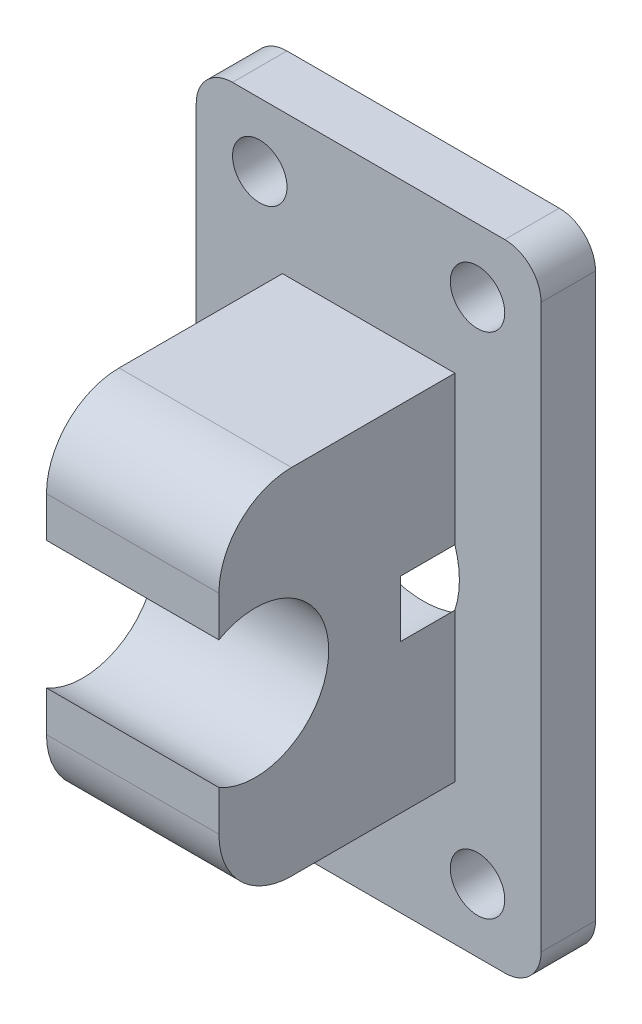
ISO-10303-21;
HEADER;
FILE_DESCRIPTION(('STEP AP214'),'2;1');
FILE_NAME('part.step','',(''),(''),'','','');
FILE_SCHEMA(('AUTOMOTIVE_DESIGN { 1 0 10303 214 1 1 1 1 }'));
ENDSEC;
DATA;
#1=APPLICATION_CONTEXT('core data for automotive mechanical design processes');
#2=APPLICATION_PROTOCOL_DEFINITION('international standard','automotive_design',2000,#1);
#3=PRODUCT_CONTEXT('',#1,'mechanical');
#4=PRODUCT('Part','Part','',(#3));
#5=PRODUCT_RELATED_PRODUCT_CATEGORY('part','',(#4));
#6=PRODUCT_DEFINITION_FORMATION('','',#4);
#7=PRODUCT_DEFINITION_CONTEXT('part definition',#1,'design');
#8=PRODUCT_DEFINITION('design','',#6,#7);
#9=PRODUCT_DEFINITION_SHAPE('','',#8);
#10=(LENGTH_UNIT() NAMED_UNIT(*) SI_UNIT(.MILLI.,.METRE.));
#11=(NAMED_UNIT(*) PLANE_ANGLE_UNIT() SI_UNIT($,.RADIAN.));
#12=(NAMED_UNIT(*) SI_UNIT($,.STERADIAN.) SOLID_ANGLE_UNIT());
#13=UNCERTAINTY_MEASURE_WITH_UNIT(LENGTH_MEASURE(1.E-05),#10,'distance_accuracy_value','');
#14=(GEOMETRIC_REPRESENTATION_CONTEXT(3) GLOBAL_UNCERTAINTY_ASSIGNED_CONTEXT((#13)) GLOBAL_UNIT_ASSIGNED_CONTEXT((#10,
#11,#12)) REPRESENTATION_CONTEXT('',''));
#15=CARTESIAN_POINT('',(0.,0.,0.));
#16=DIRECTION('',(0.,0.,1.));
#17=DIRECTION('',(1.,0.,0.));
#18=AXIS2_PLACEMENT_3D('',#15,#16,#17);
#19=CARTESIAN_POINT('',(0.,0.,3.));
#20=DIRECTION('',(0.,0.,1.));
#21=DIRECTION('',(1.,0.,0.));
#22=AXIS2_PLACEMENT_3D('',#19,#20,#21);
#23=PLANE('',#22);
#24=CARTESIAN_POINT('',(0.,0.,3.));
#25=DIRECTION('',(0.,0.,1.));
#26=DIRECTION('',(1.,0.,0.));
#27=AXIS2_PLACEMENT_3D('',#24,#25,#26);
#28=CIRCLE('',#27,5.);
#29=CARTESIAN_POINT('',(-4.75,1.56124949959959,3.));
#30=VERTEX_POINT('',#29);
#31=CARTESIAN_POINT('',(-4.75,-1.56124949959959,3.));
#32=VERTEX_POINT('',#31);
#33=EDGE_CURVE('E586',#30,#32,#28,.T.);
#34=ORIENTED_EDGE('',*,*,#33,.F.);
#35=DIRECTION('',(0.,-1.,0.));
#36=VECTOR('',#35,1.);
#37=CARTESIAN_POINT('',(-4.75,9.75,3.));
#38=LINE('',#37,#36);
#39=CARTESIAN_POINT('',(-4.75,9.75,3.));
#40=VERTEX_POINT('',#39);
#41=EDGE_CURVE('E197',#40,#30,#38,.T.);
#42=ORIENTED_EDGE('',*,*,#41,.F.);
#43=DIRECTION('',(-1.,0.,0.));
#44=VECTOR('',#43,1.);
#45=CARTESIAN_POINT('',(-4.75,9.75,3.));
#46=LINE('',#45,#44);
#47=CARTESIAN_POINT('',(4.75,9.75,3.));
#48=VERTEX_POINT('',#47);
#49=EDGE_CURVE('E577',#48,#40,#46,.T.);
#50=ORIENTED_EDGE('',*,*,#49,.F.);
#51=DIRECTION('',(0.,1.,0.));
#52=VECTOR('',#51,1.);
#53=CARTESIAN_POINT('',(4.75,9.75,3.));
#54=LINE('',#53,#52);
#55=CARTESIAN_POINT('',(4.75,1.56124949959961,3.));
#56=VERTEX_POINT('',#55);
#57=EDGE_CURVE('E573',#56,#48,#54,.T.);
#58=ORIENTED_EDGE('',*,*,#57,.F.);
#59=CARTESIAN_POINT('',(4.75,-1.5612494995996,3.));
#60=VERTEX_POINT('',#59);
#61=EDGE_CURVE('E583',#60,#56,#28,.T.);
#62=ORIENTED_EDGE('',*,*,#61,.F.);
#63=CARTESIAN_POINT('',(4.75,-9.75,3.));
#64=VERTEX_POINT('',#63);
#65=EDGE_CURVE('E574',#64,#60,#54,.T.);
#66=ORIENTED_EDGE('',*,*,#65,.F.);
#67=DIRECTION('',(1.,0.,0.));
#68=VECTOR('',#67,1.);
#69=CARTESIAN_POINT('',(-4.75,-9.75,3.));
#70=LINE('',#69,#68);
#71=CARTESIAN_POINT('',(-4.75,-9.75,3.));
#72=VERTEX_POINT('',#71);
#73=EDGE_CURVE('E232',#72,#64,#70,.T.);
#74=ORIENTED_EDGE('',*,*,#73,.F.);
#75=EDGE_CURVE('E226',#32,#72,#38,.T.);
#76=ORIENTED_EDGE('',*,*,#75,.F.);
#77=EDGE_LOOP('',(#34,#42,#50,#58,#62,#66,#74,#76));
#78=FACE_BOUND('',#77,.T.);
#79=CARTESIAN_POINT('',(6.,-14.,3.));
#80=DIRECTION('',(0.,0.,1.));
#81=DIRECTION('',(1.,0.,0.));
#82=AXIS2_PLACEMENT_3D('',#79,#80,#81);
#83=CIRCLE('',#82,1.5);
#84=CARTESIAN_POINT('',(7.5,-14.,3.));
#85=VERTEX_POINT('',#84);
#86=EDGE_CURVE('E244',#85,#85,#83,.T.);
#87=ORIENTED_EDGE('',*,*,#86,.F.);
#88=EDGE_LOOP('',(#87));
#89=FACE_BOUND('',#88,.T.);
#90=CARTESIAN_POINT('',(-6.,14.,3.));
#91=DIRECTION('',(0.,0.,1.));
#92=DIRECTION('',(1.,0.,0.));
#93=AXIS2_PLACEMENT_3D('',#90,#91,#92);
#94=CIRCLE('',#93,1.5);
#95=CARTESIAN_POINT('',(-4.5,14.,3.));
#96=VERTEX_POINT('',#95);
#97=EDGE_CURVE('E256',#96,#96,#94,.T.);
#98=ORIENTED_EDGE('',*,*,#97,.F.);
#99=EDGE_LOOP('',(#98));
#100=FACE_BOUND('',#99,.T.);
#101=DIRECTION('',(1.,0.,0.));
#102=VECTOR('',#101,1.);
#103=CARTESIAN_POINT('',(-9.5,-17.5,3.));
#104=LINE('',#103,#102);
#105=CARTESIAN_POINT('',(-7.5,-17.5,3.));
#106=VERTEX_POINT('',#105);
#107=CARTESIAN_POINT('',(7.5,-17.5,3.));
#108=VERTEX_POINT('',#107);
#109=EDGE_CURVE('E272',#106,#108,#104,.T.);
#110=ORIENTED_EDGE('',*,*,#109,.T.);
#111=CARTESIAN_POINT('',(7.5,-15.5,3.));
#112=DIRECTION('',(0.,0.,1.));
#113=DIRECTION('',(1.,0.,0.));
#114=AXIS2_PLACEMENT_3D('',#111,#112,#113);
#115=CIRCLE('',#114,2.);
#116=CARTESIAN_POINT('',(9.5,-15.5,3.));
#117=VERTEX_POINT('',#116);
#118=EDGE_CURVE('E315',#108,#117,#115,.T.);
#119=ORIENTED_EDGE('',*,*,#118,.T.);
#120=DIRECTION('',(0.,1.,0.));
#121=VECTOR('',#120,1.);
#122=CARTESIAN_POINT('',(9.5,17.5,3.));
#123=LINE('',#122,#121);
#124=CARTESIAN_POINT('',(9.5,15.5,3.));
#125=VERTEX_POINT('',#124);
#126=EDGE_CURVE('E262',#117,#125,#123,.T.);
#127=ORIENTED_EDGE('',*,*,#126,.T.);
#128=CARTESIAN_POINT('',(7.5,15.5,3.));
#129=DIRECTION('',(0.,0.,1.));
#130=DIRECTION('',(1.,0.,0.));
#131=AXIS2_PLACEMENT_3D('',#128,#129,#130);
#132=CIRCLE('',#131,2.);
#133=CARTESIAN_POINT('',(7.5,17.5,3.));
#134=VERTEX_POINT('',#133);
#135=EDGE_CURVE('E311',#125,#134,#132,.T.);
#136=ORIENTED_EDGE('',*,*,#135,.T.);
#137=DIRECTION('',(-1.,0.,0.));
#138=VECTOR('',#137,1.);
#139=CARTESIAN_POINT('',(-9.5,17.5,3.));
#140=LINE('',#139,#138);
#141=CARTESIAN_POINT('',(-7.5,17.5,3.));
#142=VERTEX_POINT('',#141);
#143=EDGE_CURVE('E265',#134,#142,#140,.T.);
#144=ORIENTED_EDGE('',*,*,#143,.T.);
#145=CARTESIAN_POINT('',(-7.5,15.5,3.));
#146=DIRECTION('',(0.,0.,1.));
#147=DIRECTION('',(1.,0.,0.));
#148=AXIS2_PLACEMENT_3D('',#145,#146,#147);
#149=CIRCLE('',#148,2.);
#150=CARTESIAN_POINT('',(-9.5,15.5,3.));
#151=VERTEX_POINT('',#150);
#152=EDGE_CURVE('E313',#142,#151,#149,.T.);
#153=ORIENTED_EDGE('',*,*,#152,.T.);
#154=DIRECTION('',(0.,-1.,0.));
#155=VECTOR('',#154,1.);
#156=CARTESIAN_POINT('',(-9.5,17.5,3.));
#157=LINE('',#156,#155);
#158=CARTESIAN_POINT('',(-9.5,-15.5,3.));
#159=VERTEX_POINT('',#158);
#160=EDGE_CURVE('E269',#151,#159,#157,.T.);
#161=ORIENTED_EDGE('',*,*,#160,.T.);
#162=CARTESIAN_POINT('',(-7.5,-15.5,3.));
#163=DIRECTION('',(0.,0.,1.));
#164=DIRECTION('',(1.,0.,0.));
#165=AXIS2_PLACEMENT_3D('',#162,#163,#164);
#166=CIRCLE('',#165,2.);
#167=EDGE_CURVE('E309',#159,#106,#166,.T.);
#168=ORIENTED_EDGE('',*,*,#167,.T.);
#169=EDGE_LOOP('',(#110,#119,#127,#136,#144,#153,#161,#168));
#170=FACE_BOUND('',#169,.T.);
#171=CARTESIAN_POINT('',(6.,14.,3.));
#172=DIRECTION('',(0.,0.,1.));
#173=DIRECTION('',(1.,0.,0.));
#174=AXIS2_PLACEMENT_3D('',#171,#172,#173);
#175=CIRCLE('',#174,1.5);
#176=CARTESIAN_POINT('',(7.5,14.,3.));
#177=VERTEX_POINT('',#176);
#178=EDGE_CURVE('E250',#177,#177,#175,.T.);
#179=ORIENTED_EDGE('',*,*,#178,.F.);
#180=EDGE_LOOP('',(#179));
#181=FACE_BOUND('',#180,.T.);
#182=CARTESIAN_POINT('',(-5.99999999999999,-14.,3.));
#183=DIRECTION('',(0.,0.,1.));
#184=DIRECTION('',(1.,0.,0.));
#185=AXIS2_PLACEMENT_3D('',#182,#183,#184);
#186=CIRCLE('',#185,1.5);
#187=CARTESIAN_POINT('',(-4.49999999999999,-14.,3.));
#188=VERTEX_POINT('',#187);
#189=EDGE_CURVE('E238',#188,#188,#186,.T.);
#190=ORIENTED_EDGE('',*,*,#189,.F.);
#191=EDGE_LOOP('',(#190));
#192=FACE_BOUND('',#191,.T.);
#193=ADVANCED_FACE('F36',(#78,#89,#100,#170,#181,#192),#23,.T.);
#194=CARTESIAN_POINT('',(0.,0.,0.));
#195=DIRECTION('',(0.,0.,1.));
#196=DIRECTION('',(1.,0.,0.));
#197=AXIS2_PLACEMENT_3D('',#194,#195,#196);
#198=PLANE('',#197);
#199=CARTESIAN_POINT('',(0.,0.,0.));
#200=DIRECTION('',(0.,0.,-1.));
#201=DIRECTION('',(-1.,0.,0.));
#202=AXIS2_PLACEMENT_3D('',#199,#200,#201);
#203=CIRCLE('',#202,5.);
#204=CARTESIAN_POINT('',(-5.,0.,0.));
#205=VERTEX_POINT('',#204);
#206=EDGE_CURVE('E593',#205,#205,#203,.T.);
#207=ORIENTED_EDGE('',*,*,#206,.F.);
#208=EDGE_LOOP('',(#207));
#209=FACE_BOUND('',#208,.T.);
#210=DIRECTION('',(0.,1.,0.));
#211=VECTOR('',#210,1.);
#212=CARTESIAN_POINT('',(9.5,17.5,0.));
#213=LINE('',#212,#211);
#214=CARTESIAN_POINT('',(9.5,-15.5,0.));
#215=VERTEX_POINT('',#214);
#216=CARTESIAN_POINT('',(9.5,15.5,0.));
#217=VERTEX_POINT('',#216);
#218=EDGE_CURVE('E259',#215,#217,#213,.T.);
#219=ORIENTED_EDGE('',*,*,#218,.F.);
#220=CARTESIAN_POINT('',(7.5,-15.5,0.));
#221=DIRECTION('',(0.,0.,1.));
#222=DIRECTION('',(1.,0.,0.));
#223=AXIS2_PLACEMENT_3D('',#220,#221,#222);
#224=CIRCLE('',#223,2.);
#225=CARTESIAN_POINT('',(7.5,-17.5,0.));
#226=VERTEX_POINT('',#225);
#227=EDGE_CURVE('E302',#215,#226,#224,.F.);
#228=ORIENTED_EDGE('',*,*,#227,.T.);
#229=DIRECTION('',(1.,0.,0.));
#230=VECTOR('',#229,1.);
#231=CARTESIAN_POINT('',(-9.5,-17.5,0.));
#232=LINE('',#231,#230);
#233=CARTESIAN_POINT('',(-7.5,-17.5,0.));
#234=VERTEX_POINT('',#233);
#235=EDGE_CURVE('E266',#234,#226,#232,.T.);
#236=ORIENTED_EDGE('',*,*,#235,.F.);
#237=CARTESIAN_POINT('',(-7.5,-15.5,0.));
#238=DIRECTION('',(0.,0.,1.));
#239=DIRECTION('',(1.,0.,0.));
#240=AXIS2_PLACEMENT_3D('',#237,#238,#239);
#241=CIRCLE('',#240,2.);
#242=CARTESIAN_POINT('',(-9.5,-15.5,0.));
#243=VERTEX_POINT('',#242);
#244=EDGE_CURVE('E296',#234,#243,#241,.F.);
#245=ORIENTED_EDGE('',*,*,#244,.T.);
#246=DIRECTION('',(0.,-1.,0.));
#247=VECTOR('',#246,1.);
#248=CARTESIAN_POINT('',(-9.5,17.5,0.));
#249=LINE('',#248,#247);
#250=CARTESIAN_POINT('',(-9.5,15.5,0.));
#251=VERTEX_POINT('',#250);
#252=EDGE_CURVE('E281',#251,#243,#249,.T.);
#253=ORIENTED_EDGE('',*,*,#252,.F.);
#254=CARTESIAN_POINT('',(-7.5,15.5,0.));
#255=DIRECTION('',(0.,0.,1.));
#256=DIRECTION('',(1.,0.,0.));
#257=AXIS2_PLACEMENT_3D('',#254,#255,#256);
#258=CIRCLE('',#257,2.);
#259=CARTESIAN_POINT('',(-7.5,17.5,0.));
#260=VERTEX_POINT('',#259);
#261=EDGE_CURVE('E300',#251,#260,#258,.F.);
#262=ORIENTED_EDGE('',*,*,#261,.T.);
#263=DIRECTION('',(-1.,0.,0.));
#264=VECTOR('',#263,1.);
#265=CARTESIAN_POINT('',(-9.5,17.5,0.));
#266=LINE('',#265,#264);
#267=CARTESIAN_POINT('',(7.5,17.5,0.));
#268=VERTEX_POINT('',#267);
#269=EDGE_CURVE('E278',#268,#260,#266,.T.);
#270=ORIENTED_EDGE('',*,*,#269,.F.);
#271=CARTESIAN_POINT('',(7.5,15.5,0.));
#272=DIRECTION('',(0.,0.,1.));
#273=DIRECTION('',(1.,0.,0.));
#274=AXIS2_PLACEMENT_3D('',#271,#272,#273);
#275=CIRCLE('',#274,2.);
#276=EDGE_CURVE('E298',#268,#217,#275,.F.);
#277=ORIENTED_EDGE('',*,*,#276,.T.);
#278=EDGE_LOOP('',(#219,#228,#236,#245,#253,#262,#270,#277));
#279=FACE_BOUND('',#278,.T.);
#280=CARTESIAN_POINT('',(-6.,14.,0.));
#281=DIRECTION('',(0.,0.,1.));
#282=DIRECTION('',(1.,0.,0.));
#283=AXIS2_PLACEMENT_3D('',#280,#281,#282);
#284=CIRCLE('',#283,1.5);
#285=CARTESIAN_POINT('',(-4.5,14.,0.));
#286=VERTEX_POINT('',#285);
#287=EDGE_CURVE('E253',#286,#286,#284,.T.);
#288=ORIENTED_EDGE('',*,*,#287,.T.);
#289=EDGE_LOOP('',(#288));
#290=FACE_BOUND('',#289,.T.);
#291=CARTESIAN_POINT('',(6.,14.,0.));
#292=DIRECTION('',(0.,0.,1.));
#293=DIRECTION('',(1.,0.,0.));
#294=AXIS2_PLACEMENT_3D('',#291,#292,#293);
#295=CIRCLE('',#294,1.5);
#296=CARTESIAN_POINT('',(7.5,14.,0.));
#297=VERTEX_POINT('',#296);
#298=EDGE_CURVE('E247',#297,#297,#295,.T.);
#299=ORIENTED_EDGE('',*,*,#298,.T.);
#300=EDGE_LOOP('',(#299));
#301=FACE_BOUND('',#300,.T.);
#302=CARTESIAN_POINT('',(6.,-14.,0.));
#303=DIRECTION('',(0.,0.,1.));
#304=DIRECTION('',(1.,0.,0.));
#305=AXIS2_PLACEMENT_3D('',#302,#303,#304);
#306=CIRCLE('',#305,1.5);
#307=CARTESIAN_POINT('',(7.5,-14.,0.));
#308=VERTEX_POINT('',#307);
#309=EDGE_CURVE('E241',#308,#308,#306,.T.);
#310=ORIENTED_EDGE('',*,*,#309,.T.);
#311=EDGE_LOOP('',(#310));
#312=FACE_BOUND('',#311,.T.);
#313=CARTESIAN_POINT('',(-5.99999999999999,-14.,0.));
#314=DIRECTION('',(0.,0.,1.));
#315=DIRECTION('',(1.,0.,0.));
#316=AXIS2_PLACEMENT_3D('',#313,#314,#315);
#317=CIRCLE('',#316,1.5);
#318=CARTESIAN_POINT('',(-4.49999999999999,-14.,0.));
#319=VERTEX_POINT('',#318);
#320=EDGE_CURVE('E237',#319,#319,#317,.T.);
#321=ORIENTED_EDGE('',*,*,#320,.T.);
#322=EDGE_LOOP('',(#321));
#323=FACE_BOUND('',#322,.T.);
#324=ADVANCED_FACE('F344',(#209,#279,#290,#301,#312,#323),#198,.F.);
#325=CARTESIAN_POINT('',(9.5,17.5,3.));
#326=DIRECTION('',(-1.,0.,0.));
#327=DIRECTION('',(0.,-1.,0.));
#328=AXIS2_PLACEMENT_3D('',#325,#326,#327);
#329=PLANE('',#328);
#330=ORIENTED_EDGE('',*,*,#126,.F.);
#331=DIRECTION('',(0.,0.,-1.));
#332=VECTOR('',#331,1.);
#333=CARTESIAN_POINT('',(9.5,-15.5,3.));
#334=LINE('',#333,#332);
#335=EDGE_CURVE('E293',#117,#215,#334,.T.);
#336=ORIENTED_EDGE('',*,*,#335,.T.);
#337=ORIENTED_EDGE('',*,*,#218,.T.);
#338=DIRECTION('',(0.,0.,-1.));
#339=VECTOR('',#338,1.);
#340=CARTESIAN_POINT('',(9.5,15.5,3.));
#341=LINE('',#340,#339);
#342=EDGE_CURVE('E291',#217,#125,#341,.F.);
#343=ORIENTED_EDGE('',*,*,#342,.T.);
#344=EDGE_LOOP('',(#330,#336,#337,#343));
#345=FACE_BOUND('',#344,.T.);
#346=ADVANCED_FACE('F361',(#345),#329,.F.);
#347=CARTESIAN_POINT('',(-9.5,17.5,3.));
#348=DIRECTION('',(0.,-1.,0.));
#349=DIRECTION('',(1.,0.,0.));
#350=AXIS2_PLACEMENT_3D('',#347,#348,#349);
#351=PLANE('',#350);
#352=ORIENTED_EDGE('',*,*,#269,.T.);
#353=DIRECTION('',(0.,0.,-1.));
#354=VECTOR('',#353,1.);
#355=CARTESIAN_POINT('',(-7.5,17.5,3.));
#356=LINE('',#355,#354);
#357=EDGE_CURVE('E183',#260,#142,#356,.F.);
#358=ORIENTED_EDGE('',*,*,#357,.T.);
#359=ORIENTED_EDGE('',*,*,#143,.F.);
#360=DIRECTION('',(0.,0.,-1.));
#361=VECTOR('',#360,1.);
#362=CARTESIAN_POINT('',(7.5,17.5,3.));
#363=LINE('',#362,#361);
#364=EDGE_CURVE('E322',#134,#268,#363,.T.);
#365=ORIENTED_EDGE('',*,*,#364,.T.);
#366=EDGE_LOOP('',(#352,#358,#359,#365));
#367=FACE_BOUND('',#366,.T.);
#368=ADVANCED_FACE('F327',(#367),#351,.F.);
#369=CARTESIAN_POINT('',(-9.5,17.5,3.));
#370=DIRECTION('',(1.,0.,0.));
#371=DIRECTION('',(0.,1.,0.));
#372=AXIS2_PLACEMENT_3D('',#369,#370,#371);
#373=PLANE('',#372);
#374=ORIENTED_EDGE('',*,*,#160,.F.);
#375=DIRECTION('',(0.,0.,-1.));
#376=VECTOR('',#375,1.);
#377=CARTESIAN_POINT('',(-9.5,15.5,3.));
#378=LINE('',#377,#376);
#379=EDGE_CURVE('E319',#151,#251,#378,.T.);
#380=ORIENTED_EDGE('',*,*,#379,.T.);
#381=ORIENTED_EDGE('',*,*,#252,.T.);
#382=DIRECTION('',(0.,0.,-1.));
#383=VECTOR('',#382,1.);
#384=CARTESIAN_POINT('',(-9.5,-15.5,3.));
#385=LINE('',#384,#383);
#386=EDGE_CURVE('E317',#243,#159,#385,.F.);
#387=ORIENTED_EDGE('',*,*,#386,.T.);
#388=EDGE_LOOP('',(#374,#380,#381,#387));
#389=FACE_BOUND('',#388,.T.);
#390=ADVANCED_FACE('F340',(#389),#373,.F.);
#391=CARTESIAN_POINT('',(-9.5,-17.5,3.));
#392=DIRECTION('',(0.,1.,0.));
#393=DIRECTION('',(0.,0.,1.));
#394=AXIS2_PLACEMENT_3D('',#391,#392,#393);
#395=PLANE('',#394);
#396=ORIENTED_EDGE('',*,*,#235,.T.);
#397=DIRECTION('',(0.,0.,-1.));
#398=VECTOR('',#397,1.);
#399=CARTESIAN_POINT('',(7.5,-17.5,3.));
#400=LINE('',#399,#398);
#401=EDGE_CURVE('E307',#226,#108,#400,.F.);
#402=ORIENTED_EDGE('',*,*,#401,.T.);
#403=ORIENTED_EDGE('',*,*,#109,.F.);
#404=DIRECTION('',(0.,0.,-1.));
#405=VECTOR('',#404,1.);
#406=CARTESIAN_POINT('',(-7.5,-17.5,3.));
#407=LINE('',#406,#405);
#408=EDGE_CURVE('E304',#106,#234,#407,.T.);
#409=ORIENTED_EDGE('',*,*,#408,.T.);
#410=EDGE_LOOP('',(#396,#402,#403,#409));
#411=FACE_BOUND('',#410,.T.);
#412=ADVANCED_FACE('F353',(#411),#395,.F.);
#413=CARTESIAN_POINT('',(-6.,14.,3.));
#414=DIRECTION('',(0.,0.,-1.));
#415=DIRECTION('',(-1.,0.,0.));
#416=AXIS2_PLACEMENT_3D('',#413,#414,#415);
#417=CYLINDRICAL_SURFACE('',#416,1.5);
#418=ORIENTED_EDGE('',*,*,#97,.T.);
#419=EDGE_LOOP('',(#418));
#420=FACE_BOUND('',#419,.T.);
#421=ORIENTED_EDGE('',*,*,#287,.F.);
#422=EDGE_LOOP('',(#421));
#423=FACE_BOUND('',#422,.T.);
#424=ADVANCED_FACE('F383',(#420,#423),#417,.F.);
#425=CARTESIAN_POINT('',(6.,14.,3.));
#426=DIRECTION('',(0.,0.,-1.));
#427=DIRECTION('',(-1.,0.,0.));
#428=AXIS2_PLACEMENT_3D('',#425,#426,#427);
#429=CYLINDRICAL_SURFACE('',#428,1.5);
#430=ORIENTED_EDGE('',*,*,#178,.T.);
#431=EDGE_LOOP('',(#430));
#432=FACE_BOUND('',#431,.T.);
#433=ORIENTED_EDGE('',*,*,#298,.F.);
#434=EDGE_LOOP('',(#433));
#435=FACE_BOUND('',#434,.T.);
#436=ADVANCED_FACE('F429',(#432,#435),#429,.F.);
#437=CARTESIAN_POINT('',(6.,-14.,3.));
#438=DIRECTION('',(0.,0.,-1.));
#439=DIRECTION('',(-1.,0.,0.));
#440=AXIS2_PLACEMENT_3D('',#437,#438,#439);
#441=CYLINDRICAL_SURFACE('',#440,1.5);
#442=ORIENTED_EDGE('',*,*,#86,.T.);
#443=EDGE_LOOP('',(#442));
#444=FACE_BOUND('',#443,.T.);
#445=ORIENTED_EDGE('',*,*,#309,.F.);
#446=EDGE_LOOP('',(#445));
#447=FACE_BOUND('',#446,.T.);
#448=ADVANCED_FACE('F426',(#444,#447),#441,.F.);
#449=CARTESIAN_POINT('',(-5.99999999999999,-14.,3.));
#450=DIRECTION('',(0.,0.,-1.));
#451=DIRECTION('',(-1.,0.,0.));
#452=AXIS2_PLACEMENT_3D('',#449,#450,#451);
#453=CYLINDRICAL_SURFACE('',#452,1.5);
#454=ORIENTED_EDGE('',*,*,#189,.T.);
#455=EDGE_LOOP('',(#454));
#456=FACE_BOUND('',#455,.T.);
#457=ORIENTED_EDGE('',*,*,#320,.F.);
#458=EDGE_LOOP('',(#457));
#459=FACE_BOUND('',#458,.T.);
#460=ADVANCED_FACE('F423',(#456,#459),#453,.F.);
#461=CARTESIAN_POINT('',(4.75,9.75,19.));
#462=DIRECTION('',(-1.,0.,0.));
#463=DIRECTION('',(0.,-1.,0.));
#464=AXIS2_PLACEMENT_3D('',#461,#462,#463);
#465=PLANE('',#464);
#466=DIRECTION('',(0.,0.,-1.));
#467=VECTOR('',#466,1.);
#468=CARTESIAN_POINT('',(4.75,9.75,19.));
#469=LINE('',#468,#467);
#470=CARTESIAN_POINT('',(4.75,9.75,12.));
#471=VERTEX_POINT('',#470);
#472=EDGE_CURVE('E230',#471,#48,#469,.T.);
#473=ORIENTED_EDGE('',*,*,#472,.F.);
#474=CARTESIAN_POINT('',(4.75,5.75,12.));
#475=DIRECTION('',(-1.,0.,0.));
#476=DIRECTION('',(0.,-1.,0.));
#477=AXIS2_PLACEMENT_3D('',#474,#475,#476);
#478=CIRCLE('',#477,4.);
#479=CARTESIAN_POINT('',(4.75,5.75,16.));
#480=VERTEX_POINT('',#479);
#481=EDGE_CURVE('E213',#471,#480,#478,.F.);
#482=ORIENTED_EDGE('',*,*,#481,.T.);
#483=DIRECTION('',(0.,-1.,0.));
#484=VECTOR('',#483,1.);
#485=CARTESIAN_POINT('',(4.75,9.75,16.));
#486=LINE('',#485,#484);
#487=CARTESIAN_POINT('',(4.75,3.52171833058807,16.));
#488=VERTEX_POINT('',#487);
#489=EDGE_CURVE('E557',#480,#488,#486,.T.);
#490=ORIENTED_EDGE('',*,*,#489,.T.);
#491=CARTESIAN_POINT('',(4.75,0.,14.));
#492=DIRECTION('',(-1.,0.,0.));
#493=DIRECTION('',(0.,-1.,0.));
#494=AXIS2_PLACEMENT_3D('',#491,#492,#493);
#495=CIRCLE('',#494,4.05);
#496=CARTESIAN_POINT('',(4.75,-3.52171833058806,16.));
#497=VERTEX_POINT('',#496);
#498=EDGE_CURVE('E571',#488,#497,#495,.T.);
#499=ORIENTED_EDGE('',*,*,#498,.T.);
#500=CARTESIAN_POINT('',(4.75,-5.75,16.));
#501=VERTEX_POINT('',#500);
#502=EDGE_CURVE('E561',#497,#501,#486,.T.);
#503=ORIENTED_EDGE('',*,*,#502,.T.);
#504=CARTESIAN_POINT('',(4.75,-5.75,12.));
#505=DIRECTION('',(-1.,0.,0.));
#506=DIRECTION('',(0.,-1.,0.));
#507=AXIS2_PLACEMENT_3D('',#504,#505,#506);
#508=CIRCLE('',#507,4.);
#509=CARTESIAN_POINT('',(4.75,-9.75,12.));
#510=VERTEX_POINT('',#509);
#511=EDGE_CURVE('E51',#501,#510,#508,.F.);
#512=ORIENTED_EDGE('',*,*,#511,.T.);
#513=DIRECTION('',(0.,0.,-1.));
#514=VECTOR('',#513,1.);
#515=CARTESIAN_POINT('',(4.75,-9.75,19.));
#516=LINE('',#515,#514);
#517=EDGE_CURVE('E222',#510,#64,#516,.T.);
#518=ORIENTED_EDGE('',*,*,#517,.T.);
#519=ORIENTED_EDGE('',*,*,#65,.T.);
#520=DIRECTION('',(0.,0.,-1.));
#521=VECTOR('',#520,1.);
#522=CARTESIAN_POINT('',(4.75,-1.5612494995996,6.));
#523=LINE('',#522,#521);
#524=CARTESIAN_POINT('',(4.75,-1.5612494995996,6.));
#525=VERTEX_POINT('',#524);
#526=EDGE_CURVE('E585',#60,#525,#523,.F.);
#527=ORIENTED_EDGE('',*,*,#526,.T.);
#528=DIRECTION('',(0.,-1.,0.));
#529=VECTOR('',#528,1.);
#530=CARTESIAN_POINT('',(4.75,9.75,6.));
#531=LINE('',#530,#529);
#532=CARTESIAN_POINT('',(4.75,1.56124949959961,6.));
#533=VERTEX_POINT('',#532);
#534=EDGE_CURVE('E191',#533,#525,#531,.T.);
#535=ORIENTED_EDGE('',*,*,#534,.F.);
#536=DIRECTION('',(0.,0.,-1.));
#537=VECTOR('',#536,1.);
#538=CARTESIAN_POINT('',(4.75,1.56124949959961,6.));
#539=LINE('',#538,#537);
#540=EDGE_CURVE('E189',#533,#56,#539,.T.);
#541=ORIENTED_EDGE('',*,*,#540,.T.);
#542=ORIENTED_EDGE('',*,*,#57,.T.);
#543=EDGE_LOOP('',(#473,#482,#490,#499,#503,#512,#518,#519,#527,#535,#541,#542));
#544=FACE_BOUND('',#543,.T.);
#545=ADVANCED_FACE('F419',(#544),#465,.F.);
#546=CARTESIAN_POINT('',(-4.75,9.75,19.));
#547=DIRECTION('',(0.,-1.,0.));
#548=DIRECTION('',(0.,0.,-1.));
#549=AXIS2_PLACEMENT_3D('',#546,#547,#548);
#550=PLANE('',#549);
#551=DIRECTION('',(0.,0.,-1.));
#552=VECTOR('',#551,1.);
#553=CARTESIAN_POINT('',(-4.75,9.75,19.));
#554=LINE('',#553,#552);
#555=CARTESIAN_POINT('',(-4.75,9.75,12.));
#556=VERTEX_POINT('',#555);
#557=EDGE_CURVE('E228',#556,#40,#554,.T.);
#558=ORIENTED_EDGE('',*,*,#557,.F.);
#559=DIRECTION('',(-1.,0.,0.));
#560=VECTOR('',#559,1.);
#561=CARTESIAN_POINT('',(-4.75,9.75,12.));
#562=LINE('',#561,#560);
#563=EDGE_CURVE('E210',#556,#471,#562,.F.);
#564=ORIENTED_EDGE('',*,*,#563,.T.);
#565=ORIENTED_EDGE('',*,*,#472,.T.);
#566=ORIENTED_EDGE('',*,*,#49,.T.);
#567=EDGE_LOOP('',(#558,#564,#565,#566));
#568=FACE_BOUND('',#567,.T.);
#569=ADVANCED_FACE('F416',(#568),#550,.F.);
#570=CARTESIAN_POINT('',(-4.75,9.75,19.));
#571=DIRECTION('',(1.,0.,0.));
#572=DIRECTION('',(0.,1.,0.));
#573=AXIS2_PLACEMENT_3D('',#570,#571,#572);
#574=PLANE('',#573);
#575=DIRECTION('',(0.,-1.,0.));
#576=VECTOR('',#575,1.);
#577=CARTESIAN_POINT('',(-4.75,9.75,16.));
#578=LINE('',#577,#576);
#579=CARTESIAN_POINT('',(-4.75,5.75,16.));
#580=VERTEX_POINT('',#579);
#581=CARTESIAN_POINT('',(-4.75,3.52171833058806,16.));
#582=VERTEX_POINT('',#581);
#583=EDGE_CURVE('E562',#580,#582,#578,.T.);
#584=ORIENTED_EDGE('',*,*,#583,.F.);
#585=CARTESIAN_POINT('',(-4.75,5.75,12.));
#586=DIRECTION('',(1.,0.,0.));
#587=DIRECTION('',(0.,1.,0.));
#588=AXIS2_PLACEMENT_3D('',#585,#586,#587);
#589=CIRCLE('',#588,4.);
#590=EDGE_CURVE('E208',#580,#556,#589,.F.);
#591=ORIENTED_EDGE('',*,*,#590,.T.);
#592=ORIENTED_EDGE('',*,*,#557,.T.);
#593=ORIENTED_EDGE('',*,*,#41,.T.);
#594=DIRECTION('',(0.,0.,-1.));
#595=VECTOR('',#594,1.);
#596=CARTESIAN_POINT('',(-4.75,1.56124949959959,6.));
#597=LINE('',#596,#595);
#598=CARTESIAN_POINT('',(-4.75,1.56124949959959,6.));
#599=VERTEX_POINT('',#598);
#600=EDGE_CURVE('E182',#30,#599,#597,.F.);
#601=ORIENTED_EDGE('',*,*,#600,.T.);
#602=DIRECTION('',(0.,1.,0.));
#603=VECTOR('',#602,1.);
#604=CARTESIAN_POINT('',(-4.75,9.75,6.));
#605=LINE('',#604,#603);
#606=CARTESIAN_POINT('',(-4.75,-1.56124949959959,6.));
#607=VERTEX_POINT('',#606);
#608=EDGE_CURVE('E171',#607,#599,#605,.T.);
#609=ORIENTED_EDGE('',*,*,#608,.F.);
#610=DIRECTION('',(0.,0.,-1.));
#611=VECTOR('',#610,1.);
#612=CARTESIAN_POINT('',(-4.75,-1.56124949959959,6.));
#613=LINE('',#612,#611);
#614=EDGE_CURVE('E198',#607,#32,#613,.T.);
#615=ORIENTED_EDGE('',*,*,#614,.T.);
#616=ORIENTED_EDGE('',*,*,#75,.T.);
#617=DIRECTION('',(0.,0.,-1.));
#618=VECTOR('',#617,1.);
#619=CARTESIAN_POINT('',(-4.75,-9.75,19.));
#620=LINE('',#619,#618);
#621=CARTESIAN_POINT('',(-4.75,-9.75,12.));
#622=VERTEX_POINT('',#621);
#623=EDGE_CURVE('E220',#622,#72,#620,.T.);
#624=ORIENTED_EDGE('',*,*,#623,.F.);
#625=CARTESIAN_POINT('',(-4.75,-5.75,12.));
#626=DIRECTION('',(1.,0.,0.));
#627=DIRECTION('',(0.,1.,0.));
#628=AXIS2_PLACEMENT_3D('',#625,#626,#627);
#629=CIRCLE('',#628,4.);
#630=CARTESIAN_POINT('',(-4.75,-5.75,16.));
#631=VERTEX_POINT('',#630);
#632=EDGE_CURVE('E206',#622,#631,#629,.F.);
#633=ORIENTED_EDGE('',*,*,#632,.T.);
#634=CARTESIAN_POINT('',(-4.75,-3.52171833058806,16.));
#635=VERTEX_POINT('',#634);
#636=EDGE_CURVE('E565',#635,#631,#578,.T.);
#637=ORIENTED_EDGE('',*,*,#636,.F.);
#638=CARTESIAN_POINT('',(-4.75,0.,14.));
#639=DIRECTION('',(-1.,0.,0.));
#640=DIRECTION('',(0.,-1.,0.));
#641=AXIS2_PLACEMENT_3D('',#638,#639,#640);
#642=CIRCLE('',#641,4.05);
#643=EDGE_CURVE('E564',#582,#635,#642,.T.);
#644=ORIENTED_EDGE('',*,*,#643,.F.);
#645=EDGE_LOOP('',(#584,#591,#592,#593,#601,#609,#615,#616,#624,#633,#637,#644));
#646=FACE_BOUND('',#645,.T.);
#647=ADVANCED_FACE('F195',(#646),#574,.F.);
#648=CARTESIAN_POINT('',(-4.75,-9.75,19.));
#649=DIRECTION('',(0.,1.,0.));
#650=DIRECTION('',(0.,0.,1.));
#651=AXIS2_PLACEMENT_3D('',#648,#649,#650);
#652=PLANE('',#651);
#653=ORIENTED_EDGE('',*,*,#517,.F.);
#654=DIRECTION('',(-1.,0.,0.));
#655=VECTOR('',#654,1.);
#656=CARTESIAN_POINT('',(-4.75,-9.75,12.));
#657=LINE('',#656,#655);
#658=EDGE_CURVE('E44',#510,#622,#657,.T.);
#659=ORIENTED_EDGE('',*,*,#658,.T.);
#660=ORIENTED_EDGE('',*,*,#623,.T.);
#661=ORIENTED_EDGE('',*,*,#73,.T.);
#662=EDGE_LOOP('',(#653,#659,#660,#661));
#663=FACE_BOUND('',#662,.T.);
#664=ADVANCED_FACE('F218',(#663),#652,.F.);
#665=CARTESIAN_POINT('',(11.25,0.,14.));
#666=DIRECTION('',(-1.,0.,0.));
#667=DIRECTION('',(0.,-1.,0.));
#668=AXIS2_PLACEMENT_3D('',#665,#666,#667);
#669=CYLINDRICAL_SURFACE('',#668,4.05);
#670=ORIENTED_EDGE('',*,*,#643,.T.);
#671=DIRECTION('',(-1.,0.,0.));
#672=VECTOR('',#671,1.);
#673=CARTESIAN_POINT('',(11.25,-3.52171833058806,16.));
#674=LINE('',#673,#672);
#675=EDGE_CURVE('E288',#635,#497,#674,.F.);
#676=ORIENTED_EDGE('',*,*,#675,.T.);
#677=ORIENTED_EDGE('',*,*,#498,.F.);
#678=DIRECTION('',(-1.,0.,0.));
#679=VECTOR('',#678,1.);
#680=CARTESIAN_POINT('',(11.25,3.52171833058807,16.));
#681=LINE('',#680,#679);
#682=EDGE_CURVE('E275',#488,#582,#681,.T.);
#683=ORIENTED_EDGE('',*,*,#682,.T.);
#684=EDGE_LOOP('',(#670,#676,#677,#683));
#685=FACE_BOUND('',#684,.T.);
#686=ADVANCED_FACE('F404',(#685),#669,.F.);
#687=CARTESIAN_POINT('',(11.25,9.75,16.));
#688=DIRECTION('',(0.,0.,-1.));
#689=DIRECTION('',(0.,1.,0.));
#690=AXIS2_PLACEMENT_3D('',#687,#688,#689);
#691=PLANE('',#690);
#692=ORIENTED_EDGE('',*,*,#489,.F.);
#693=DIRECTION('',(-1.,0.,0.));
#694=VECTOR('',#693,1.);
#695=CARTESIAN_POINT('',(11.25,5.75,16.));
#696=LINE('',#695,#694);
#697=EDGE_CURVE('E200',#480,#580,#696,.T.);
#698=ORIENTED_EDGE('',*,*,#697,.T.);
#699=ORIENTED_EDGE('',*,*,#583,.T.);
#700=ORIENTED_EDGE('',*,*,#682,.F.);
#701=EDGE_LOOP('',(#692,#698,#699,#700));
#702=FACE_BOUND('',#701,.T.);
#703=ADVANCED_FACE('F399',(#702),#691,.F.);
#704=ORIENTED_EDGE('',*,*,#636,.T.);
#705=DIRECTION('',(-1.,0.,0.));
#706=VECTOR('',#705,1.);
#707=CARTESIAN_POINT('',(11.25,-5.75,16.));
#708=LINE('',#707,#706);
#709=EDGE_CURVE('E11',#631,#501,#708,.F.);
#710=ORIENTED_EDGE('',*,*,#709,.T.);
#711=ORIENTED_EDGE('',*,*,#502,.F.);
#712=ORIENTED_EDGE('',*,*,#675,.F.);
#713=EDGE_LOOP('',(#704,#710,#711,#712));
#714=FACE_BOUND('',#713,.T.);
#715=ADVANCED_FACE('F395',(#714),#691,.F.);
#716=CARTESIAN_POINT('',(7.5,-15.5,3.));
#717=DIRECTION('',(0.,0.,-1.));
#718=DIRECTION('',(-1.,0.,0.));
#719=AXIS2_PLACEMENT_3D('',#716,#717,#718);
#720=CYLINDRICAL_SURFACE('',#719,2.);
#721=ORIENTED_EDGE('',*,*,#118,.F.);
#722=ORIENTED_EDGE('',*,*,#401,.F.);
#723=ORIENTED_EDGE('',*,*,#227,.F.);
#724=ORIENTED_EDGE('',*,*,#335,.F.);
#725=EDGE_LOOP('',(#721,#722,#723,#724));
#726=FACE_BOUND('',#725,.T.);
#727=ADVANCED_FACE('F359',(#726),#720,.T.);
#728=CARTESIAN_POINT('',(-7.5,15.5,3.));
#729=DIRECTION('',(0.,0.,-1.));
#730=DIRECTION('',(-1.,0.,0.));
#731=AXIS2_PLACEMENT_3D('',#728,#729,#730);
#732=CYLINDRICAL_SURFACE('',#731,2.);
#733=ORIENTED_EDGE('',*,*,#152,.F.);
#734=ORIENTED_EDGE('',*,*,#357,.F.);
#735=ORIENTED_EDGE('',*,*,#261,.F.);
#736=ORIENTED_EDGE('',*,*,#379,.F.);
#737=EDGE_LOOP('',(#733,#734,#735,#736));
#738=FACE_BOUND('',#737,.T.);
#739=ADVANCED_FACE('F337',(#738),#732,.T.);
#740=CARTESIAN_POINT('',(7.5,15.5,3.));
#741=DIRECTION('',(0.,0.,-1.));
#742=DIRECTION('',(-1.,0.,0.));
#743=AXIS2_PLACEMENT_3D('',#740,#741,#742);
#744=CYLINDRICAL_SURFACE('',#743,2.);
#745=ORIENTED_EDGE('',*,*,#135,.F.);
#746=ORIENTED_EDGE('',*,*,#342,.F.);
#747=ORIENTED_EDGE('',*,*,#276,.F.);
#748=ORIENTED_EDGE('',*,*,#364,.F.);
#749=EDGE_LOOP('',(#745,#746,#747,#748));
#750=FACE_BOUND('',#749,.T.);
#751=ADVANCED_FACE('F364',(#750),#744,.T.);
#752=CARTESIAN_POINT('',(-7.5,-15.5,3.));
#753=DIRECTION('',(0.,0.,-1.));
#754=DIRECTION('',(-1.,0.,0.));
#755=AXIS2_PLACEMENT_3D('',#752,#753,#754);
#756=CYLINDRICAL_SURFACE('',#755,2.);
#757=ORIENTED_EDGE('',*,*,#167,.F.);
#758=ORIENTED_EDGE('',*,*,#386,.F.);
#759=ORIENTED_EDGE('',*,*,#244,.F.);
#760=ORIENTED_EDGE('',*,*,#408,.F.);
#761=EDGE_LOOP('',(#757,#758,#759,#760));
#762=FACE_BOUND('',#761,.T.);
#763=ADVANCED_FACE('F350',(#762),#756,.T.);
#764=CARTESIAN_POINT('',(0.,0.,6.));
#765=DIRECTION('',(0.,0.,-1.));
#766=DIRECTION('',(-1.,0.,0.));
#767=AXIS2_PLACEMENT_3D('',#764,#765,#766);
#768=CYLINDRICAL_SURFACE('',#767,5.);
#769=ORIENTED_EDGE('',*,*,#206,.T.);
#770=EDGE_LOOP('',(#769));
#771=FACE_BOUND('',#770,.T.);
#772=CARTESIAN_POINT('',(0.,0.,6.));
#773=DIRECTION('',(0.,0.,-1.));
#774=DIRECTION('',(-1.,0.,0.));
#775=AXIS2_PLACEMENT_3D('',#772,#773,#774);
#776=CIRCLE('',#775,5.);
#777=EDGE_CURVE('E174',#599,#533,#776,.T.);
#778=ORIENTED_EDGE('',*,*,#777,.F.);
#779=ORIENTED_EDGE('',*,*,#600,.F.);
#780=ORIENTED_EDGE('',*,*,#33,.T.);
#781=ORIENTED_EDGE('',*,*,#614,.F.);
#782=EDGE_CURVE('E177',#525,#607,#776,.T.);
#783=ORIENTED_EDGE('',*,*,#782,.F.);
#784=ORIENTED_EDGE('',*,*,#526,.F.);
#785=ORIENTED_EDGE('',*,*,#61,.T.);
#786=ORIENTED_EDGE('',*,*,#540,.F.);
#787=EDGE_LOOP('',(#778,#779,#780,#781,#783,#784,#785,#786));
#788=FACE_BOUND('',#787,.T.);
#789=ADVANCED_FACE('F186',(#771,#788),#768,.F.);
#790=CARTESIAN_POINT('',(0.,0.,6.));
#791=DIRECTION('',(0.,0.,-1.));
#792=DIRECTION('',(-1.,0.,0.));
#793=AXIS2_PLACEMENT_3D('',#790,#791,#792);
#794=PLANE('',#793);
#795=ORIENTED_EDGE('',*,*,#534,.T.);
#796=ORIENTED_EDGE('',*,*,#782,.T.);
#797=ORIENTED_EDGE('',*,*,#608,.T.);
#798=ORIENTED_EDGE('',*,*,#777,.T.);
#799=EDGE_LOOP('',(#795,#796,#797,#798));
#800=FACE_BOUND('',#799,.T.);
#801=ADVANCED_FACE('F173',(#800),#794,.T.);
#802=CARTESIAN_POINT('',(11.25,5.75,12.));
#803=DIRECTION('',(-1.,0.,0.));
#804=DIRECTION('',(0.,0.,1.));
#805=AXIS2_PLACEMENT_3D('',#802,#803,#804);
#806=CYLINDRICAL_SURFACE('',#805,4.);
#807=ORIENTED_EDGE('',*,*,#481,.F.);
#808=ORIENTED_EDGE('',*,*,#563,.F.);
#809=ORIENTED_EDGE('',*,*,#590,.F.);
#810=ORIENTED_EDGE('',*,*,#697,.F.);
#811=EDGE_LOOP('',(#807,#808,#809,#810));
#812=FACE_BOUND('',#811,.T.);
#813=ADVANCED_FACE('F497',(#812),#806,.T.);
#814=CARTESIAN_POINT('',(-4.75,-5.75,12.));
#815=DIRECTION('',(-1.,0.,0.));
#816=DIRECTION('',(0.,0.,1.));
#817=AXIS2_PLACEMENT_3D('',#814,#815,#816);
#818=CYLINDRICAL_SURFACE('',#817,4.);
#819=ORIENTED_EDGE('',*,*,#511,.F.);
#820=ORIENTED_EDGE('',*,*,#709,.F.);
#821=ORIENTED_EDGE('',*,*,#632,.F.);
#822=ORIENTED_EDGE('',*,*,#658,.F.);
#823=EDGE_LOOP('',(#819,#820,#821,#822));
#824=FACE_BOUND('',#823,.T.);
#825=ADVANCED_FACE('F38',(#824),#818,.T.);
#826=CLOSED_SHELL('',(#193,#324,#346,#368,#390,#412,#424,#436,#448,#460,#545,#569,#647,#664,
#686,#703,#715,#727,#739,#751,#763,#789,#801,#813,#825));
#827=MANIFOLD_SOLID_BREP('B2',#826);
#828=ADVANCED_BREP_SHAPE_REPRESENTATION('',(#18,#827),#14);
#829=SHAPE_DEFINITION_REPRESENTATION(#9,#828);
ENDSEC;
END-ISO-10303-21;
